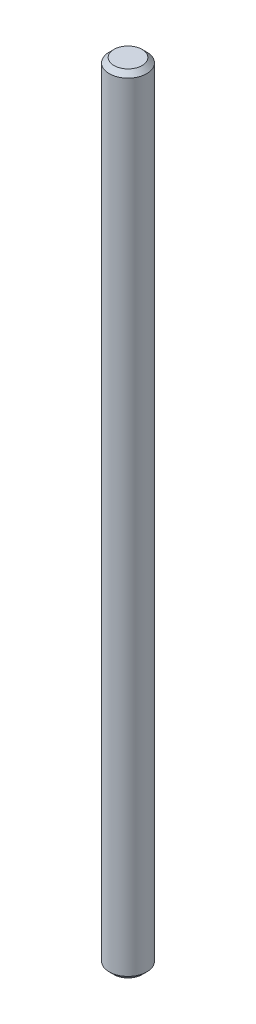
ISO-10303-21;
HEADER;
FILE_DESCRIPTION(('STEP AP214'),'2;1');
FILE_NAME('part.step','',(''),(''),'','','');
FILE_SCHEMA(('AUTOMOTIVE_DESIGN { 1 0 10303 214 1 1 1 1 }'));
ENDSEC;
DATA;
#1=APPLICATION_CONTEXT('core data for automotive mechanical design processes');
#2=APPLICATION_PROTOCOL_DEFINITION('international standard','automotive_design',2000,#1);
#3=PRODUCT_CONTEXT('',#1,'mechanical');
#4=PRODUCT('Part','Part','',(#3));
#5=PRODUCT_RELATED_PRODUCT_CATEGORY('part','',(#4));
#6=PRODUCT_DEFINITION_FORMATION('','',#4);
#7=PRODUCT_DEFINITION_CONTEXT('part definition',#1,'design');
#8=PRODUCT_DEFINITION('design','',#6,#7);
#9=PRODUCT_DEFINITION_SHAPE('','',#8);
#10=(LENGTH_UNIT() NAMED_UNIT(*) SI_UNIT(.MILLI.,.METRE.));
#11=(NAMED_UNIT(*) PLANE_ANGLE_UNIT() SI_UNIT($,.RADIAN.));
#12=(NAMED_UNIT(*) SI_UNIT($,.STERADIAN.) SOLID_ANGLE_UNIT());
#13=UNCERTAINTY_MEASURE_WITH_UNIT(LENGTH_MEASURE(1.E-05),#10,'distance_accuracy_value','');
#14=(GEOMETRIC_REPRESENTATION_CONTEXT(3) GLOBAL_UNCERTAINTY_ASSIGNED_CONTEXT((#13)) GLOBAL_UNIT_ASSIGNED_CONTEXT((#10,
#11,#12)) REPRESENTATION_CONTEXT('',''));
#15=CARTESIAN_POINT('',(0.,0.,0.));
#16=DIRECTION('',(0.,0.,1.));
#17=DIRECTION('',(1.,0.,0.));
#18=AXIS2_PLACEMENT_3D('',#15,#16,#17);
#19=CARTESIAN_POINT('',(0.,42.,0.));
#20=DIRECTION('',(0.,-1.,0.));
#21=DIRECTION('',(0.,0.,-1.));
#22=AXIS2_PLACEMENT_3D('',#19,#20,#21);
#23=CYLINDRICAL_SURFACE('',#22,2.);
#24=CARTESIAN_POINT('',(0.,41.5,0.));
#25=DIRECTION('',(0.,1.,0.));
#26=DIRECTION('',(0.,0.,1.));
#27=AXIS2_PLACEMENT_3D('',#24,#25,#26);
#28=CIRCLE('',#27,2.);
#29=CARTESIAN_POINT('',(0.,41.5,-2.));
#30=VERTEX_POINT('',#29);
#31=EDGE_CURVE('E57',#30,#30,#28,.F.);
#32=CARTESIAN_POINT('',(0.,-41.4999999999999,0.));
#33=DIRECTION('',(0.,1.,0.));
#34=DIRECTION('',(0.,0.,1.));
#35=AXIS2_PLACEMENT_3D('',#32,#33,#34);
#36=CIRCLE('',#35,2.);
#37=CARTESIAN_POINT('',(0.,-41.4999999999999,-2.));
#38=VERTEX_POINT('',#37);
#39=EDGE_CURVE('E62',#38,#38,#36,.T.);
#40=CARTESIAN_POINT('',(0.,41.5,-2.));
#41=CARTESIAN_POINT('',(0.,40.6354166666667,-2.));
#42=CARTESIAN_POINT('',(0.,39.7708333333334,-2.));
#43=CARTESIAN_POINT('',(0.,38.0416666666667,-2.));
#44=CARTESIAN_POINT('',(0.,37.1770833333334,-2.));
#45=CARTESIAN_POINT('',(0.,35.4479166666667,-2.));
#46=CARTESIAN_POINT('',(0.,34.5833333333334,-2.));
#47=CARTESIAN_POINT('',(0.,32.8541666666667,-2.));
#48=CARTESIAN_POINT('',(0.,31.9895833333334,-2.));
#49=CARTESIAN_POINT('',(0.,30.2604166666667,-2.));
#50=CARTESIAN_POINT('',(0.,29.3958333333334,-2.));
#51=CARTESIAN_POINT('',(0.,27.6666666666667,-2.));
#52=CARTESIAN_POINT('',(0.,26.8020833333334,-2.));
#53=CARTESIAN_POINT('',(0.,25.0729166666667,-2.));
#54=CARTESIAN_POINT('',(0.,24.2083333333334,-2.));
#55=CARTESIAN_POINT('',(0.,22.4791666666667,-2.));
#56=CARTESIAN_POINT('',(0.,21.6145833333334,-2.));
#57=CARTESIAN_POINT('',(0.,19.8854166666667,-2.));
#58=CARTESIAN_POINT('',(0.,19.0208333333334,-2.));
#59=CARTESIAN_POINT('',(0.,17.2916666666667,-2.));
#60=CARTESIAN_POINT('',(0.,16.4270833333334,-2.));
#61=CARTESIAN_POINT('',(0.,14.6979166666667,-2.));
#62=CARTESIAN_POINT('',(0.,13.8333333333334,-2.));
#63=CARTESIAN_POINT('',(0.,12.1041666666667,-2.));
#64=CARTESIAN_POINT('',(0.,11.2395833333334,-2.));
#65=CARTESIAN_POINT('',(0.,9.5104166666667,-2.));
#66=CARTESIAN_POINT('',(0.,8.64583333333337,-2.));
#67=CARTESIAN_POINT('',(0.,6.9166666666667,-2.));
#68=CARTESIAN_POINT('',(0.,6.05208333333337,-2.));
#69=CARTESIAN_POINT('',(0.,4.3229166666667,-2.));
#70=CARTESIAN_POINT('',(0.,3.45833333333337,-2.));
#71=CARTESIAN_POINT('',(0.,1.7291666666667,-2.));
#72=CARTESIAN_POINT('',(0.,0.864583333333372,-2.));
#73=CARTESIAN_POINT('',(0.,-0.864583333333294,-2.));
#74=CARTESIAN_POINT('',(0.,-1.72916666666663,-2.));
#75=CARTESIAN_POINT('',(0.,-3.45833333333329,-2.));
#76=CARTESIAN_POINT('',(0.,-4.32291666666663,-2.));
#77=CARTESIAN_POINT('',(0.,-6.05208333333329,-2.));
#78=CARTESIAN_POINT('',(0.,-6.91666666666663,-2.));
#79=CARTESIAN_POINT('',(0.,-8.64583333333329,-2.));
#80=CARTESIAN_POINT('',(0.,-9.51041666666662,-2.));
#81=CARTESIAN_POINT('',(0.,-11.2395833333333,-2.));
#82=CARTESIAN_POINT('',(0.,-12.1041666666666,-2.));
#83=CARTESIAN_POINT('',(0.,-13.8333333333333,-2.));
#84=CARTESIAN_POINT('',(0.,-14.6979166666666,-2.));
#85=CARTESIAN_POINT('',(0.,-16.4270833333333,-2.));
#86=CARTESIAN_POINT('',(0.,-17.2916666666666,-2.));
#87=CARTESIAN_POINT('',(0.,-19.0208333333333,-2.));
#88=CARTESIAN_POINT('',(0.,-19.8854166666666,-2.));
#89=CARTESIAN_POINT('',(0.,-21.6145833333333,-2.));
#90=CARTESIAN_POINT('',(0.,-22.4791666666666,-2.));
#91=CARTESIAN_POINT('',(0.,-24.2083333333333,-2.));
#92=CARTESIAN_POINT('',(0.,-25.0729166666666,-2.));
#93=CARTESIAN_POINT('',(0.,-26.8020833333333,-2.));
#94=CARTESIAN_POINT('',(0.,-27.6666666666666,-2.));
#95=CARTESIAN_POINT('',(0.,-29.3958333333333,-2.));
#96=CARTESIAN_POINT('',(0.,-30.2604166666666,-2.));
#97=CARTESIAN_POINT('',(0.,-31.9895833333333,-2.));
#98=CARTESIAN_POINT('',(0.,-32.8541666666666,-2.));
#99=CARTESIAN_POINT('',(0.,-34.5833333333333,-2.));
#100=CARTESIAN_POINT('',(0.,-35.4479166666666,-2.));
#101=CARTESIAN_POINT('',(0.,-37.1770833333333,-2.));
#102=CARTESIAN_POINT('',(0.,-38.0416666666666,-2.));
#103=CARTESIAN_POINT('',(0.,-39.7708333333333,-2.));
#104=CARTESIAN_POINT('',(0.,-40.6354166666666,-2.));
#105=CARTESIAN_POINT('',(0.,-41.4999999999999,-2.));
#106=B_SPLINE_CURVE_WITH_KNOTS('',3,(#40,#41,#42,#43,#44,#45,#46,#47,#48,#49,#50,#51,#52,#53,
#54,#55,#56,#57,#58,#59,#60,#61,#62,#63,#64,#65,#66,#67,#68,#69,#70,#71,#72,#73,#74,#75,#76,#77,
#78,#79,#80,#81,#82,#83,#84,#85,#86,#87,#88,#89,#90,#91,#92,#93,#94,#95,#96,#97,#98,#99,#100,
#101,#102,#103,#104,#105),.UNSPECIFIED.,.F.,.F.,(4,2,2,2,2,2,2,2,2,2,2,2,2,2,2,2,2,2,2,2,2,2,2,
2,2,2,2,2,2,2,2,2,4),(0.,2.59375000000001,5.1875,7.78125,10.375,12.96875,15.5625,18.15625,20.75,
23.34375,25.9375,28.53125,31.125,33.71875,36.3125,38.90625,41.5,44.09375,46.6875,49.28125,
51.875,54.46875,57.0625,59.65625,62.25,64.84375,67.4375,70.03125,72.625,75.21875,77.8125,
80.40625,83.),.UNSPECIFIED.);
#107=EDGE_CURVE('BSEAM48',#30,#38,#106,.T.);
#108=ORIENTED_EDGE('',*,*,#31,.T.);
#109=ORIENTED_EDGE('',*,*,#39,.T.);
#110=ORIENTED_EDGE('',*,*,#107,.T.);
#111=ORIENTED_EDGE('',*,*,#107,.F.);
#112=EDGE_LOOP('',(#108,#110,#109,#111));
#113=FACE_BOUND('',#112,.T.);
#114=ADVANCED_FACE('F48',(#113),#23,.T.);
#115=CARTESIAN_POINT('',(0.,42.,0.));
#116=DIRECTION('',(0.,1.,0.));
#117=DIRECTION('',(0.,0.,1.));
#118=AXIS2_PLACEMENT_3D('',#115,#116,#117);
#119=PLANE('',#118);
#120=CARTESIAN_POINT('',(0.,42.,0.));
#121=DIRECTION('',(0.,1.,0.));
#122=DIRECTION('',(0.,0.,1.));
#123=AXIS2_PLACEMENT_3D('',#120,#121,#122);
#124=CIRCLE('',#123,1.50000000000003);
#125=CARTESIAN_POINT('',(0.,42.,1.50000000000003));
#126=VERTEX_POINT('',#125);
#127=EDGE_CURVE('E67',#126,#126,#124,.T.);
#128=ORIENTED_EDGE('',*,*,#127,.T.);
#129=EDGE_LOOP('',(#128));
#130=FACE_BOUND('',#129,.T.);
#131=ADVANCED_FACE('F74',(#130),#119,.T.);
#132=CARTESIAN_POINT('',(0.,-42.,0.));
#133=DIRECTION('',(0.,1.,0.));
#134=DIRECTION('',(0.,0.,1.));
#135=AXIS2_PLACEMENT_3D('',#132,#133,#134);
#136=PLANE('',#135);
#137=CARTESIAN_POINT('',(0.,-42.,0.));
#138=DIRECTION('',(0.,1.,0.));
#139=DIRECTION('',(0.,0.,1.));
#140=AXIS2_PLACEMENT_3D('',#137,#138,#139);
#141=CIRCLE('',#140,1.49999999999992);
#142=CARTESIAN_POINT('',(0.,-42.,1.49999999999992));
#143=VERTEX_POINT('',#142);
#144=EDGE_CURVE('E10',#143,#143,#141,.F.);
#145=ORIENTED_EDGE('',*,*,#144,.T.);
#146=EDGE_LOOP('',(#145));
#147=FACE_BOUND('',#146,.T.);
#148=ADVANCED_FACE('F78',(#147),#136,.F.);
#149=CARTESIAN_POINT('',(0.,42.,0.));
#150=DIRECTION('',(0.,-1.,0.));
#151=DIRECTION('',(0.,0.,-1.));
#152=AXIS2_PLACEMENT_3D('',#149,#150,#151);
#153=CONICAL_SURFACE('',#152,1.50000000000003,0.785398163397447);
#154=ORIENTED_EDGE('',*,*,#31,.F.);
#155=EDGE_LOOP('',(#154));
#156=FACE_BOUND('',#155,.T.);
#157=ORIENTED_EDGE('',*,*,#127,.F.);
#158=EDGE_LOOP('',(#157));
#159=FACE_BOUND('',#158,.T.);
#160=ADVANCED_FACE('F76',(#156,#159),#153,.T.);
#161=CARTESIAN_POINT('',(0.,-41.4999999999999,0.));
#162=DIRECTION('',(0.,1.,0.));
#163=DIRECTION('',(0.,0.,1.));
#164=AXIS2_PLACEMENT_3D('',#161,#162,#163);
#165=CONICAL_SURFACE('',#164,2.,0.785398163397454);
#166=ORIENTED_EDGE('',*,*,#144,.F.);
#167=EDGE_LOOP('',(#166));
#168=FACE_BOUND('',#167,.T.);
#169=ORIENTED_EDGE('',*,*,#39,.F.);
#170=EDGE_LOOP('',(#169));
#171=FACE_BOUND('',#170,.T.);
#172=ADVANCED_FACE('F51',(#168,#171),#165,.T.);
#173=CLOSED_SHELL('',(#114,#131,#148,#160,#172));
#174=MANIFOLD_SOLID_BREP('B2',#173);
#175=ADVANCED_BREP_SHAPE_REPRESENTATION('',(#18,#174),#14);
#176=SHAPE_DEFINITION_REPRESENTATION(#9,#175);
ENDSEC;
END-ISO-10303-21;
